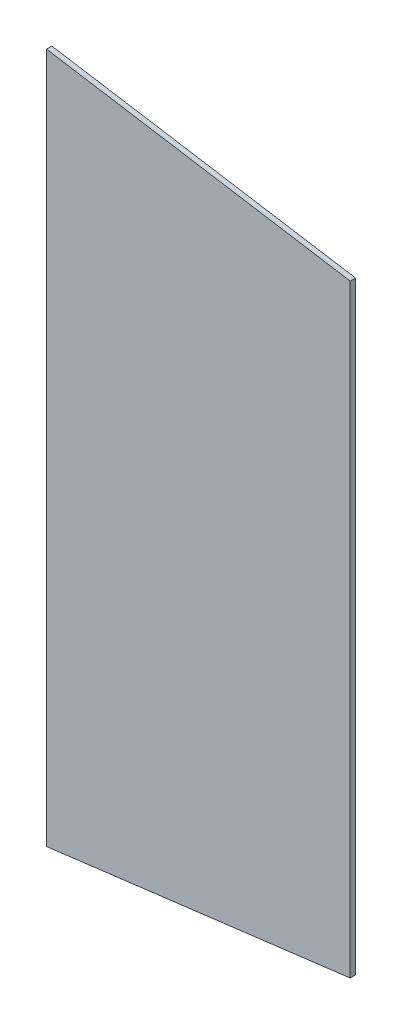
ISO-10303-21;
HEADER;
FILE_DESCRIPTION(('STEP AP214'),'2;1');
FILE_NAME('part.step','',(''),(''),'','','');
FILE_SCHEMA(('AUTOMOTIVE_DESIGN { 1 0 10303 214 1 1 1 1 }'));
ENDSEC;
DATA;
#1=APPLICATION_CONTEXT('core data for automotive mechanical design processes');
#2=APPLICATION_PROTOCOL_DEFINITION('international standard','automotive_design',2000,#1);
#3=PRODUCT_CONTEXT('',#1,'mechanical');
#4=PRODUCT('Part','Part','',(#3));
#5=PRODUCT_RELATED_PRODUCT_CATEGORY('part','',(#4));
#6=PRODUCT_DEFINITION_FORMATION('','',#4);
#7=PRODUCT_DEFINITION_CONTEXT('part definition',#1,'design');
#8=PRODUCT_DEFINITION('design','',#6,#7);
#9=PRODUCT_DEFINITION_SHAPE('','',#8);
#10=(LENGTH_UNIT() NAMED_UNIT(*) SI_UNIT(.MILLI.,.METRE.));
#11=(NAMED_UNIT(*) PLANE_ANGLE_UNIT() SI_UNIT($,.RADIAN.));
#12=(NAMED_UNIT(*) SI_UNIT($,.STERADIAN.) SOLID_ANGLE_UNIT());
#13=UNCERTAINTY_MEASURE_WITH_UNIT(LENGTH_MEASURE(1.E-05),#10,'distance_accuracy_value','');
#14=(GEOMETRIC_REPRESENTATION_CONTEXT(3) GLOBAL_UNCERTAINTY_ASSIGNED_CONTEXT((#13)) GLOBAL_UNIT_ASSIGNED_CONTEXT((#10,
#11,#12)) REPRESENTATION_CONTEXT('',''));
#15=CARTESIAN_POINT('',(0.,0.,0.));
#16=DIRECTION('',(0.,0.,1.));
#17=DIRECTION('',(1.,0.,0.));
#18=AXIS2_PLACEMENT_3D('',#15,#16,#17);
#19=CARTESIAN_POINT('',(-183.714285714286,81.4399813947427,2.));
#20=DIRECTION('',(-0.159440191703083,-0.987207589754903,0.));
#21=DIRECTION('',(0.987207589754903,-0.159440191703083,0.));
#22=AXIS2_PLACEMENT_3D('',#19,#20,#21);
#23=PLANE('',#22);
#24=DIRECTION('',(-0.987207589754903,0.159440191703083,0.));
#25=VECTOR('',#24,1.);
#26=CARTESIAN_POINT('',(-183.714285714286,81.4399813947427,0.));
#27=LINE('',#26,#25);
#28=CARTESIAN_POINT('',(-69.7142857142858,63.028269367018,0.));
#29=VERTEX_POINT('',#28);
#30=CARTESIAN_POINT('',(-183.714285714286,81.4399813947427,0.));
#31=VERTEX_POINT('',#30);
#32=EDGE_CURVE('E96',#29,#31,#27,.T.);
#33=ORIENTED_EDGE('',*,*,#32,.T.);
#34=DIRECTION('',(0.,0.,-1.));
#35=VECTOR('',#34,1.);
#36=CARTESIAN_POINT('',(-183.714285714286,81.4399813947427,2.));
#37=LINE('',#36,#35);
#38=CARTESIAN_POINT('',(-183.714285714286,81.4399813947427,2.));
#39=VERTEX_POINT('',#38);
#40=EDGE_CURVE('E11',#39,#31,#37,.T.);
#41=ORIENTED_EDGE('',*,*,#40,.F.);
#42=DIRECTION('',(-0.987207589754903,0.159440191703083,0.));
#43=VECTOR('',#42,1.);
#44=CARTESIAN_POINT('',(-183.714285714286,81.4399813947427,2.));
#45=LINE('',#44,#43);
#46=CARTESIAN_POINT('',(-69.7142857142858,63.028269367018,2.));
#47=VERTEX_POINT('',#46);
#48=EDGE_CURVE('E84',#47,#39,#45,.T.);
#49=ORIENTED_EDGE('',*,*,#48,.F.);
#50=DIRECTION('',(0.,0.,-1.));
#51=VECTOR('',#50,1.);
#52=CARTESIAN_POINT('',(-69.7142857142858,63.028269367018,2.));
#53=LINE('',#52,#51);
#54=EDGE_CURVE('E92',#47,#29,#53,.T.);
#55=ORIENTED_EDGE('',*,*,#54,.T.);
#56=EDGE_LOOP('',(#33,#41,#49,#55));
#57=FACE_BOUND('',#56,.T.);
#58=ADVANCED_FACE('F33',(#57),#23,.F.);
#59=CARTESIAN_POINT('',(-183.714285714286,-177.734435562925,2.));
#60=DIRECTION('',(1.,0.,0.));
#61=DIRECTION('',(0.,1.,0.));
#62=AXIS2_PLACEMENT_3D('',#59,#60,#61);
#63=PLANE('',#62);
#64=DIRECTION('',(0.,-1.,0.));
#65=VECTOR('',#64,1.);
#66=CARTESIAN_POINT('',(-183.714285714286,-177.734435562925,0.));
#67=LINE('',#66,#65);
#68=CARTESIAN_POINT('',(-183.714285714286,-177.734435562925,0.));
#69=VERTEX_POINT('',#68);
#70=EDGE_CURVE('E88',#31,#69,#67,.T.);
#71=ORIENTED_EDGE('',*,*,#70,.T.);
#72=DIRECTION('',(0.,0.,-1.));
#73=VECTOR('',#72,1.);
#74=CARTESIAN_POINT('',(-183.714285714286,-177.734435562925,2.));
#75=LINE('',#74,#73);
#76=CARTESIAN_POINT('',(-183.714285714286,-177.734435562925,2.));
#77=VERTEX_POINT('',#76);
#78=EDGE_CURVE('E41',#77,#69,#75,.T.);
#79=ORIENTED_EDGE('',*,*,#78,.F.);
#80=DIRECTION('',(0.,-1.,0.));
#81=VECTOR('',#80,1.);
#82=CARTESIAN_POINT('',(-183.714285714286,-177.734435562925,2.));
#83=LINE('',#82,#81);
#84=EDGE_CURVE('E79',#39,#77,#83,.T.);
#85=ORIENTED_EDGE('',*,*,#84,.F.);
#86=ORIENTED_EDGE('',*,*,#40,.T.);
#87=EDGE_LOOP('',(#71,#79,#85,#86));
#88=FACE_BOUND('',#87,.T.);
#89=ADVANCED_FACE('F87',(#88),#63,.F.);
#90=CARTESIAN_POINT('',(-69.7142857142858,-163.484435562925,2.));
#91=DIRECTION('',(-0.124034734589208,0.992277876713668,0.));
#92=DIRECTION('',(-0.992277876713668,-0.124034734589208,0.));
#93=AXIS2_PLACEMENT_3D('',#90,#91,#92);
#94=PLANE('',#93);
#95=DIRECTION('',(0.992277876713668,0.124034734589208,0.));
#96=VECTOR('',#95,1.);
#97=CARTESIAN_POINT('',(-69.7142857142858,-163.484435562925,0.));
#98=LINE('',#97,#96);
#99=CARTESIAN_POINT('',(-69.7142857142858,-163.484435562925,0.));
#100=VERTEX_POINT('',#99);
#101=EDGE_CURVE('E66',#69,#100,#98,.T.);
#102=ORIENTED_EDGE('',*,*,#101,.T.);
#103=DIRECTION('',(0.,0.,-1.));
#104=VECTOR('',#103,1.);
#105=CARTESIAN_POINT('',(-69.7142857142858,-163.484435562925,2.));
#106=LINE('',#105,#104);
#107=CARTESIAN_POINT('',(-69.7142857142858,-163.484435562925,2.));
#108=VERTEX_POINT('',#107);
#109=EDGE_CURVE('E89',#108,#100,#106,.T.);
#110=ORIENTED_EDGE('',*,*,#109,.F.);
#111=DIRECTION('',(0.992277876713668,0.124034734589208,0.));
#112=VECTOR('',#111,1.);
#113=CARTESIAN_POINT('',(-69.7142857142858,-163.484435562925,2.));
#114=LINE('',#113,#112);
#115=EDGE_CURVE('E82',#77,#108,#114,.T.);
#116=ORIENTED_EDGE('',*,*,#115,.F.);
#117=ORIENTED_EDGE('',*,*,#78,.T.);
#118=EDGE_LOOP('',(#102,#110,#116,#117));
#119=FACE_BOUND('',#118,.T.);
#120=ADVANCED_FACE('F90',(#119),#94,.F.);
#121=CARTESIAN_POINT('',(-69.7142857142858,63.028269367018,2.));
#122=DIRECTION('',(-1.,0.,0.));
#123=DIRECTION('',(0.,-1.,0.));
#124=AXIS2_PLACEMENT_3D('',#121,#122,#123);
#125=PLANE('',#124);
#126=DIRECTION('',(0.,1.,0.));
#127=VECTOR('',#126,1.);
#128=CARTESIAN_POINT('',(-69.7142857142858,63.028269367018,0.));
#129=LINE('',#128,#127);
#130=EDGE_CURVE('E72',#100,#29,#129,.T.);
#131=ORIENTED_EDGE('',*,*,#130,.T.);
#132=ORIENTED_EDGE('',*,*,#54,.F.);
#133=DIRECTION('',(0.,1.,0.));
#134=VECTOR('',#133,1.);
#135=CARTESIAN_POINT('',(-69.7142857142858,63.028269367018,2.));
#136=LINE('',#135,#134);
#137=EDGE_CURVE('E49',#108,#47,#136,.T.);
#138=ORIENTED_EDGE('',*,*,#137,.F.);
#139=ORIENTED_EDGE('',*,*,#109,.T.);
#140=EDGE_LOOP('',(#131,#132,#138,#139));
#141=FACE_BOUND('',#140,.T.);
#142=ADVANCED_FACE('F103',(#141),#125,.F.);
#143=CARTESIAN_POINT('',(0.,0.,2.));
#144=DIRECTION('',(0.,0.,-1.));
#145=DIRECTION('',(-1.,0.,0.));
#146=AXIS2_PLACEMENT_3D('',#143,#144,#145);
#147=PLANE('',#146);
#148=ORIENTED_EDGE('',*,*,#48,.T.);
#149=ORIENTED_EDGE('',*,*,#84,.T.);
#150=ORIENTED_EDGE('',*,*,#115,.T.);
#151=ORIENTED_EDGE('',*,*,#137,.T.);
#152=EDGE_LOOP('',(#148,#149,#150,#151));
#153=FACE_BOUND('',#152,.T.);
#154=ADVANCED_FACE('F80',(#153),#147,.F.);
#155=CARTESIAN_POINT('',(0.,0.,0.));
#156=DIRECTION('',(0.,0.,-1.));
#157=DIRECTION('',(-1.,0.,0.));
#158=AXIS2_PLACEMENT_3D('',#155,#156,#157);
#159=PLANE('',#158);
#160=ORIENTED_EDGE('',*,*,#32,.F.);
#161=ORIENTED_EDGE('',*,*,#130,.F.);
#162=ORIENTED_EDGE('',*,*,#101,.F.);
#163=ORIENTED_EDGE('',*,*,#70,.F.);
#164=EDGE_LOOP('',(#160,#161,#162,#163));
#165=FACE_BOUND('',#164,.T.);
#166=ADVANCED_FACE('F106',(#165),#159,.T.);
#167=CLOSED_SHELL('',(#58,#89,#120,#142,#154,#166));
#168=MANIFOLD_SOLID_BREP('B2',#167);
#169=ADVANCED_BREP_SHAPE_REPRESENTATION('',(#18,#168),#14);
#170=SHAPE_DEFINITION_REPRESENTATION(#9,#169);
ENDSEC;
END-ISO-10303-21;
